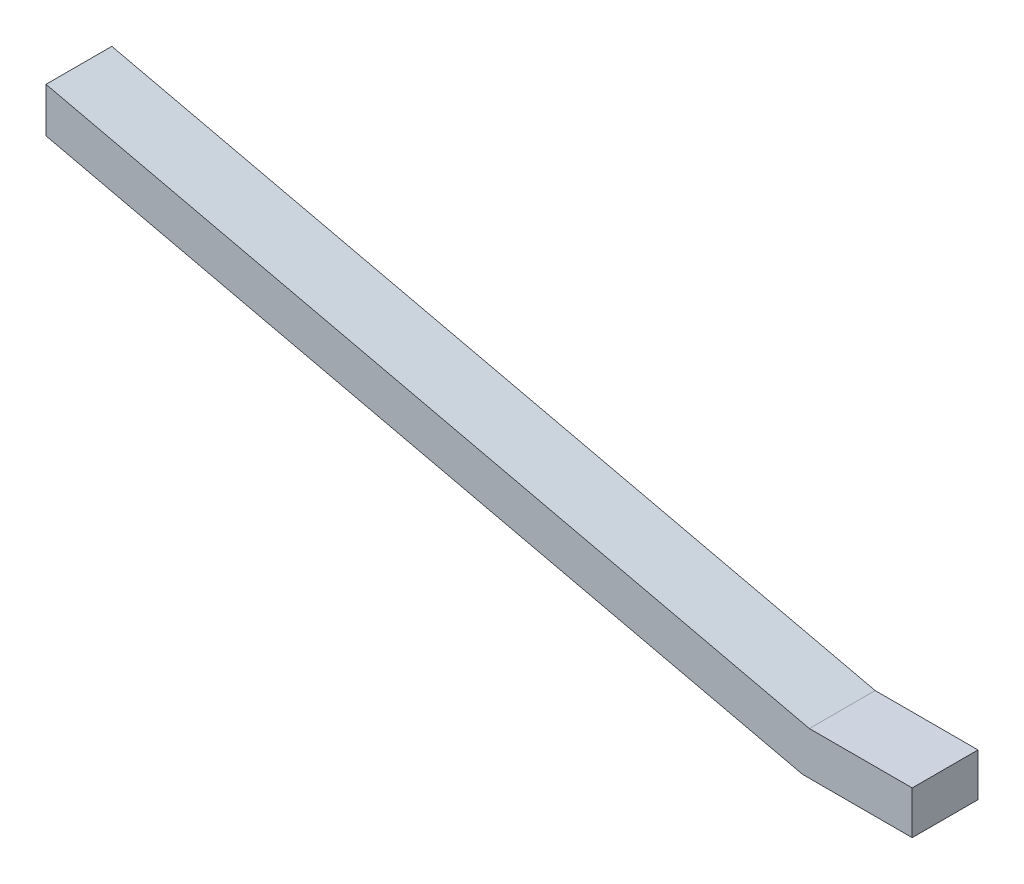
ISO-10303-21;
HEADER;
FILE_DESCRIPTION(('STEP AP214'),'2;1');
FILE_NAME('part.step','',(''),(''),'','','');
FILE_SCHEMA(('AUTOMOTIVE_DESIGN { 1 0 10303 214 1 1 1 1 }'));
ENDSEC;
DATA;
#1=APPLICATION_CONTEXT('core data for automotive mechanical design processes');
#2=APPLICATION_PROTOCOL_DEFINITION('international standard','automotive_design',2000,#1);
#3=PRODUCT_CONTEXT('',#1,'mechanical');
#4=PRODUCT('Part','Part','',(#3));
#5=PRODUCT_RELATED_PRODUCT_CATEGORY('part','',(#4));
#6=PRODUCT_DEFINITION_FORMATION('','',#4);
#7=PRODUCT_DEFINITION_CONTEXT('part definition',#1,'design');
#8=PRODUCT_DEFINITION('design','',#6,#7);
#9=PRODUCT_DEFINITION_SHAPE('','',#8);
#10=(LENGTH_UNIT() NAMED_UNIT(*) SI_UNIT(.MILLI.,.METRE.));
#11=(NAMED_UNIT(*) PLANE_ANGLE_UNIT() SI_UNIT($,.RADIAN.));
#12=(NAMED_UNIT(*) SI_UNIT($,.STERADIAN.) SOLID_ANGLE_UNIT());
#13=UNCERTAINTY_MEASURE_WITH_UNIT(LENGTH_MEASURE(1.E-05),#10,'distance_accuracy_value','');
#14=(GEOMETRIC_REPRESENTATION_CONTEXT(3) GLOBAL_UNCERTAINTY_ASSIGNED_CONTEXT((#13)) GLOBAL_UNIT_ASSIGNED_CONTEXT((#10,
#11,#12)) REPRESENTATION_CONTEXT('',''));
#15=CARTESIAN_POINT('',(0.,0.,0.));
#16=DIRECTION('',(0.,0.,1.));
#17=DIRECTION('',(1.,0.,0.));
#18=AXIS2_PLACEMENT_3D('',#15,#16,#17);
#19=CARTESIAN_POINT('',(0.,0.,1200.));
#20=DIRECTION('',(1.,0.,0.));
#21=DIRECTION('',(0.,1.,0.));
#22=AXIS2_PLACEMENT_3D('',#19,#20,#21);
#23=PLANE('',#22);
#24=DIRECTION('',(0.,-1.,0.));
#25=VECTOR('',#24,1.);
#26=CARTESIAN_POINT('',(0.,0.,0.));
#27=LINE('',#26,#25);
#28=CARTESIAN_POINT('',(0.,0.,0.));
#29=VERTEX_POINT('',#28);
#30=CARTESIAN_POINT('',(1.16226472890446E-13,-814.97335596417,0.));
#31=VERTEX_POINT('',#30);
#32=EDGE_CURVE('E119',#29,#31,#27,.T.);
#33=ORIENTED_EDGE('',*,*,#32,.T.);
#34=DIRECTION('',(0.,0.,-1.));
#35=VECTOR('',#34,1.);
#36=CARTESIAN_POINT('',(1.16226472890446E-13,-814.97335596417,1200.));
#37=LINE('',#36,#35);
#38=CARTESIAN_POINT('',(1.16226472890446E-13,-814.97335596417,1200.));
#39=VERTEX_POINT('',#38);
#40=EDGE_CURVE('E11',#39,#31,#37,.T.);
#41=ORIENTED_EDGE('',*,*,#40,.F.);
#42=DIRECTION('',(0.,-1.,0.));
#43=VECTOR('',#42,1.);
#44=CARTESIAN_POINT('',(0.,0.,1200.));
#45=LINE('',#44,#43);
#46=CARTESIAN_POINT('',(0.,0.,1200.));
#47=VERTEX_POINT('',#46);
#48=EDGE_CURVE('E129',#47,#39,#45,.T.);
#49=ORIENTED_EDGE('',*,*,#48,.F.);
#50=DIRECTION('',(0.,0.,-1.));
#51=VECTOR('',#50,1.);
#52=CARTESIAN_POINT('',(0.,0.,1200.));
#53=LINE('',#52,#51);
#54=EDGE_CURVE('E115',#47,#29,#53,.T.);
#55=ORIENTED_EDGE('',*,*,#54,.T.);
#56=EDGE_LOOP('',(#33,#41,#49,#55));
#57=FACE_BOUND('',#56,.T.);
#58=ADVANCED_FACE('F35',(#57),#23,.F.);
#59=CARTESIAN_POINT('',(1.16226472890446E-13,-814.97335596417,1200.));
#60=DIRECTION('',(0.224951054343859,0.974370064785237,0.));
#61=DIRECTION('',(-0.974370064785237,0.224951054343859,0.));
#62=AXIS2_PLACEMENT_3D('',#59,#60,#61);
#63=PLANE('',#62);
#64=DIRECTION('',(0.974370064785237,-0.224951054343858,0.));
#65=VECTOR('',#64,1.);
#66=CARTESIAN_POINT('',(1.16226472890446E-13,-814.97335596417,0.));
#67=LINE('',#66,#65);
#68=CARTESIAN_POINT('',(13795.8660675938,-4000.,0.));
#69=VERTEX_POINT('',#68);
#70=EDGE_CURVE('E122',#31,#69,#67,.T.);
#71=ORIENTED_EDGE('',*,*,#70,.T.);
#72=DIRECTION('',(0.,0.,-1.));
#73=VECTOR('',#72,1.);
#74=CARTESIAN_POINT('',(13795.8660675938,-4000.,1200.));
#75=LINE('',#74,#73);
#76=CARTESIAN_POINT('',(13795.8660675938,-4000.,1200.));
#77=VERTEX_POINT('',#76);
#78=EDGE_CURVE('E43',#77,#69,#75,.T.);
#79=ORIENTED_EDGE('',*,*,#78,.F.);
#80=DIRECTION('',(0.974370064785237,-0.224951054343858,0.));
#81=VECTOR('',#80,1.);
#82=CARTESIAN_POINT('',(1.16226472890446E-13,-814.97335596417,1200.));
#83=LINE('',#82,#81);
#84=EDGE_CURVE('E88',#39,#77,#83,.T.);
#85=ORIENTED_EDGE('',*,*,#84,.F.);
#86=ORIENTED_EDGE('',*,*,#40,.T.);
#87=EDGE_LOOP('',(#71,#79,#85,#86));
#88=FACE_BOUND('',#87,.T.);
#89=ADVANCED_FACE('F153',(#88),#63,.F.);
#90=CARTESIAN_POINT('',(15795.8660675938,-4000.,1200.));
#91=DIRECTION('',(0.,1.,0.));
#92=DIRECTION('',(-1.,0.,0.));
#93=AXIS2_PLACEMENT_3D('',#90,#91,#92);
#94=PLANE('',#93);
#95=DIRECTION('',(1.,0.,0.));
#96=VECTOR('',#95,1.);
#97=CARTESIAN_POINT('',(15795.8660675938,-4000.,0.));
#98=LINE('',#97,#96);
#99=CARTESIAN_POINT('',(15795.8660675938,-4000.,0.));
#100=VERTEX_POINT('',#99);
#101=EDGE_CURVE('E124',#69,#100,#98,.T.);
#102=ORIENTED_EDGE('',*,*,#101,.T.);
#103=DIRECTION('',(0.,0.,-1.));
#104=VECTOR('',#103,1.);
#105=CARTESIAN_POINT('',(15795.8660675938,-4000.,1200.));
#106=LINE('',#105,#104);
#107=CARTESIAN_POINT('',(15795.8660675938,-4000.,1200.));
#108=VERTEX_POINT('',#107);
#109=EDGE_CURVE('E110',#108,#100,#106,.T.);
#110=ORIENTED_EDGE('',*,*,#109,.F.);
#111=DIRECTION('',(1.,0.,0.));
#112=VECTOR('',#111,1.);
#113=CARTESIAN_POINT('',(15795.8660675938,-4000.,1200.));
#114=LINE('',#113,#112);
#115=EDGE_CURVE('E101',#77,#108,#114,.T.);
#116=ORIENTED_EDGE('',*,*,#115,.F.);
#117=ORIENTED_EDGE('',*,*,#78,.T.);
#118=EDGE_LOOP('',(#102,#110,#116,#117));
#119=FACE_BOUND('',#118,.T.);
#120=ADVANCED_FACE('F135',(#119),#94,.F.);
#121=CARTESIAN_POINT('',(15795.8660675938,-3213.91532337556,1200.));
#122=DIRECTION('',(-1.,0.,0.));
#123=DIRECTION('',(0.,-1.,0.));
#124=AXIS2_PLACEMENT_3D('',#121,#122,#123);
#125=PLANE('',#124);
#126=DIRECTION('',(0.,1.,0.));
#127=VECTOR('',#126,1.);
#128=CARTESIAN_POINT('',(15795.8660675938,-3213.91532337556,0.));
#129=LINE('',#128,#127);
#130=CARTESIAN_POINT('',(15795.8660675938,-3213.91532337556,0.));
#131=VERTEX_POINT('',#130);
#132=EDGE_CURVE('E109',#100,#131,#129,.T.);
#133=ORIENTED_EDGE('',*,*,#132,.T.);
#134=DIRECTION('',(0.,0.,-1.));
#135=VECTOR('',#134,1.);
#136=CARTESIAN_POINT('',(15795.8660675938,-3213.91532337556,1200.));
#137=LINE('',#136,#135);
#138=CARTESIAN_POINT('',(15795.8660675938,-3213.91532337556,1200.));
#139=VERTEX_POINT('',#138);
#140=EDGE_CURVE('E106',#139,#131,#137,.T.);
#141=ORIENTED_EDGE('',*,*,#140,.F.);
#142=DIRECTION('',(0.,1.,0.));
#143=VECTOR('',#142,1.);
#144=CARTESIAN_POINT('',(15795.8660675938,-3213.91532337556,1200.));
#145=LINE('',#144,#143);
#146=EDGE_CURVE('E95',#108,#139,#145,.T.);
#147=ORIENTED_EDGE('',*,*,#146,.F.);
#148=ORIENTED_EDGE('',*,*,#109,.T.);
#149=EDGE_LOOP('',(#133,#141,#147,#148));
#150=FACE_BOUND('',#149,.T.);
#151=ADVANCED_FACE('F107',(#150),#125,.F.);
#152=CARTESIAN_POINT('',(13920.9966851938,-3213.91532337556,1200.));
#153=DIRECTION('',(0.,-1.,0.));
#154=DIRECTION('',(1.,0.,0.));
#155=AXIS2_PLACEMENT_3D('',#152,#153,#154);
#156=PLANE('',#155);
#157=DIRECTION('',(-1.,0.,0.));
#158=VECTOR('',#157,1.);
#159=CARTESIAN_POINT('',(13920.9966851938,-3213.91532337556,0.));
#160=LINE('',#159,#158);
#161=CARTESIAN_POINT('',(13920.9966851938,-3213.91532337556,0.));
#162=VERTEX_POINT('',#161);
#163=EDGE_CURVE('E74',#131,#162,#160,.T.);
#164=ORIENTED_EDGE('',*,*,#163,.T.);
#165=DIRECTION('',(0.,0.,-1.));
#166=VECTOR('',#165,1.);
#167=CARTESIAN_POINT('',(13920.9966851938,-3213.91532337556,1200.));
#168=LINE('',#167,#166);
#169=CARTESIAN_POINT('',(13920.9966851938,-3213.91532337556,1200.));
#170=VERTEX_POINT('',#169);
#171=EDGE_CURVE('E111',#170,#162,#168,.T.);
#172=ORIENTED_EDGE('',*,*,#171,.F.);
#173=DIRECTION('',(-1.,0.,0.));
#174=VECTOR('',#173,1.);
#175=CARTESIAN_POINT('',(13920.9966851938,-3213.91532337556,1200.));
#176=LINE('',#175,#174);
#177=EDGE_CURVE('E99',#139,#170,#176,.T.);
#178=ORIENTED_EDGE('',*,*,#177,.F.);
#179=ORIENTED_EDGE('',*,*,#140,.T.);
#180=EDGE_LOOP('',(#164,#172,#178,#179));
#181=FACE_BOUND('',#180,.T.);
#182=ADVANCED_FACE('F113',(#181),#156,.F.);
#183=CARTESIAN_POINT('',(0.,0.,1200.));
#184=DIRECTION('',(-0.224951054343858,-0.974370064785237,0.));
#185=DIRECTION('',(0.974370064785237,-0.224951054343858,0.));
#186=AXIS2_PLACEMENT_3D('',#183,#184,#185);
#187=PLANE('',#186);
#188=DIRECTION('',(-0.974370064785237,0.224951054343858,0.));
#189=VECTOR('',#188,1.);
#190=CARTESIAN_POINT('',(0.,0.,0.));
#191=LINE('',#190,#189);
#192=EDGE_CURVE('E80',#162,#29,#191,.T.);
#193=ORIENTED_EDGE('',*,*,#192,.T.);
#194=ORIENTED_EDGE('',*,*,#54,.F.);
#195=DIRECTION('',(-0.974370064785237,0.224951054343858,0.));
#196=VECTOR('',#195,1.);
#197=CARTESIAN_POINT('',(0.,0.,1200.));
#198=LINE('',#197,#196);
#199=EDGE_CURVE('E51',#170,#47,#198,.T.);
#200=ORIENTED_EDGE('',*,*,#199,.F.);
#201=ORIENTED_EDGE('',*,*,#171,.T.);
#202=EDGE_LOOP('',(#193,#194,#200,#201));
#203=FACE_BOUND('',#202,.T.);
#204=ADVANCED_FACE('F142',(#203),#187,.F.);
#205=CARTESIAN_POINT('',(0.,0.,1200.));
#206=DIRECTION('',(0.,0.,-1.));
#207=DIRECTION('',(-1.,0.,0.));
#208=AXIS2_PLACEMENT_3D('',#205,#206,#207);
#209=PLANE('',#208);
#210=ORIENTED_EDGE('',*,*,#48,.T.);
#211=ORIENTED_EDGE('',*,*,#84,.T.);
#212=ORIENTED_EDGE('',*,*,#115,.T.);
#213=ORIENTED_EDGE('',*,*,#146,.T.);
#214=ORIENTED_EDGE('',*,*,#177,.T.);
#215=ORIENTED_EDGE('',*,*,#199,.T.);
#216=EDGE_LOOP('',(#210,#211,#212,#213,#214,#215));
#217=FACE_BOUND('',#216,.T.);
#218=ADVANCED_FACE('F97',(#217),#209,.F.);
#219=CARTESIAN_POINT('',(0.,0.,0.));
#220=DIRECTION('',(0.,0.,-1.));
#221=DIRECTION('',(-1.,0.,0.));
#222=AXIS2_PLACEMENT_3D('',#219,#220,#221);
#223=PLANE('',#222);
#224=ORIENTED_EDGE('',*,*,#32,.F.);
#225=ORIENTED_EDGE('',*,*,#192,.F.);
#226=ORIENTED_EDGE('',*,*,#163,.F.);
#227=ORIENTED_EDGE('',*,*,#132,.F.);
#228=ORIENTED_EDGE('',*,*,#101,.F.);
#229=ORIENTED_EDGE('',*,*,#70,.F.);
#230=EDGE_LOOP('',(#224,#225,#226,#227,#228,#229));
#231=FACE_BOUND('',#230,.T.);
#232=ADVANCED_FACE('F138',(#231),#223,.T.);
#233=CLOSED_SHELL('',(#58,#89,#120,#151,#182,#204,#218,#232));
#234=MANIFOLD_SOLID_BREP('B2',#233);
#235=ADVANCED_BREP_SHAPE_REPRESENTATION('',(#18,#234),#14);
#236=SHAPE_DEFINITION_REPRESENTATION(#9,#235);
ENDSEC;
END-ISO-10303-21;
